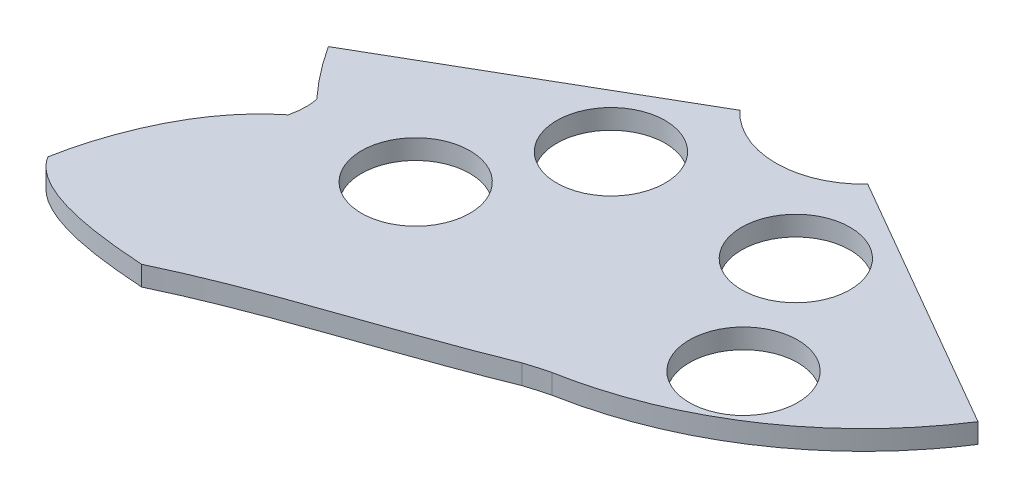
ISO-10303-21;
HEADER;
FILE_DESCRIPTION(('STEP AP214'),'2;1');
FILE_NAME('part.step','',(''),(''),'','','');
FILE_SCHEMA(('AUTOMOTIVE_DESIGN { 1 0 10303 214 1 1 1 1 }'));
ENDSEC;
DATA;
#1=APPLICATION_CONTEXT('core data for automotive mechanical design processes');
#2=APPLICATION_PROTOCOL_DEFINITION('international standard','automotive_design',2000,#1);
#3=PRODUCT_CONTEXT('',#1,'mechanical');
#4=PRODUCT('Part','Part','',(#3));
#5=PRODUCT_RELATED_PRODUCT_CATEGORY('part','',(#4));
#6=PRODUCT_DEFINITION_FORMATION('','',#4);
#7=PRODUCT_DEFINITION_CONTEXT('part definition',#1,'design');
#8=PRODUCT_DEFINITION('design','',#6,#7);
#9=PRODUCT_DEFINITION_SHAPE('','',#8);
#10=(LENGTH_UNIT() NAMED_UNIT(*) SI_UNIT(.MILLI.,.METRE.));
#11=(NAMED_UNIT(*) PLANE_ANGLE_UNIT() SI_UNIT($,.RADIAN.));
#12=(NAMED_UNIT(*) SI_UNIT($,.STERADIAN.) SOLID_ANGLE_UNIT());
#13=UNCERTAINTY_MEASURE_WITH_UNIT(LENGTH_MEASURE(1.E-05),#10,'distance_accuracy_value','');
#14=(GEOMETRIC_REPRESENTATION_CONTEXT(3) GLOBAL_UNCERTAINTY_ASSIGNED_CONTEXT((#13)) GLOBAL_UNIT_ASSIGNED_CONTEXT((#10,
#11,#12)) REPRESENTATION_CONTEXT('',''));
#15=CARTESIAN_POINT('',(0.,0.,0.));
#16=DIRECTION('',(0.,0.,1.));
#17=DIRECTION('',(1.,0.,0.));
#18=AXIS2_PLACEMENT_3D('',#15,#16,#17);
#19=CARTESIAN_POINT('',(-62.0768626037595,-107.736,48.0492829280208));
#20=DIRECTION('',(0.,-1.,0.));
#21=DIRECTION('',(0.,0.,-1.));
#22=AXIS2_PLACEMENT_3D('',#19,#20,#21);
#23=PLANE('',#22);
#24=CARTESIAN_POINT('',(18.75,-107.736,32.476));
#25=DIRECTION('',(0.,-1.,0.));
#26=DIRECTION('',(0.,0.,-1.));
#27=AXIS2_PLACEMENT_3D('',#24,#25,#26);
#28=CIRCLE('',#27,10.999845998306);
#29=CARTESIAN_POINT('',(18.75,-107.736,21.476154001694));
#30=VERTEX_POINT('',#29);
#31=EDGE_CURVE('E441',#30,#30,#28,.T.);
#32=ORIENTED_EDGE('',*,*,#31,.F.);
#33=EDGE_LOOP('',(#32));
#34=FACE_BOUND('',#33,.T.);
#35=CARTESIAN_POINT('',(-33.25,-107.736,57.591));
#36=DIRECTION('',(0.,-1.,0.));
#37=DIRECTION('',(0.,0.,-1.));
#38=AXIS2_PLACEMENT_3D('',#35,#36,#37);
#39=CIRCLE('',#38,10.999845998306);
#40=CARTESIAN_POINT('',(-33.25,-107.736,46.591154001694));
#41=VERTEX_POINT('',#40);
#42=EDGE_CURVE('E422',#41,#41,#39,.T.);
#43=ORIENTED_EDGE('',*,*,#42,.F.);
#44=EDGE_LOOP('',(#43));
#45=FACE_BOUND('',#44,.T.);
#46=CARTESIAN_POINT('',(-65.8942438215736,-107.736,42.6629141284688));
#47=CARTESIAN_POINT('',(-64.697534549004,-107.736,44.5106116386977));
#48=CARTESIAN_POINT('',(-63.4233519327905,-107.736,46.3090861546609));
#49=CARTESIAN_POINT('',(-60.7303627760698,-107.736,49.7894932698036));
#50=CARTESIAN_POINT('',(-59.3101756741057,-107.736,51.4724407077037));
#51=CARTESIAN_POINT('',(-57.8213039212769,-107.736,53.0935760003724));
#52=B_SPLINE_CURVE_WITH_KNOTS('',3,(#46,#47,#48,#49,#50,#51),.UNSPECIFIED.,.F.,.F.,(4,2,4),
(2.95319324550292E-13,0.5,0.999998050745676),.UNSPECIFIED.);
#53=CARTESIAN_POINT('',(-57.8213039212769,-107.736,53.0935760003724));
#54=VERTEX_POINT('',#53);
#55=CARTESIAN_POINT('',(-65.8942438215736,-107.736,42.6629141284688));
#56=VERTEX_POINT('',#55);
#57=EDGE_CURVE('E378',#54,#56,#52,.F.);
#58=ORIENTED_EDGE('',*,*,#57,.T.);
#59=DIRECTION('',(0.866025113443951,0.,-0.500000502884138));
#60=VECTOR('',#59,1.);
#61=CARTESIAN_POINT('',(-65.8942438215736,-107.736,42.6629141284688));
#62=LINE('',#61,#60);
#63=CARTESIAN_POINT('',(-12.9766531358799,-107.736,12.1108879302399));
#64=VERTEX_POINT('',#63);
#65=EDGE_CURVE('E103',#56,#64,#62,.T.);
#66=ORIENTED_EDGE('',*,*,#65,.T.);
#67=CARTESIAN_POINT('',(0.,-107.736,0.));
#68=DIRECTION('',(0.,1.,0.));
#69=DIRECTION('',(0.,0.,-1.));
#70=AXIS2_PLACEMENT_3D('',#67,#68,#69);
#71=CIRCLE('',#70,17.7501305084715);
#72=CARTESIAN_POINT('',(12.9766531358511,-107.736,12.1108879302707));
#73=VERTEX_POINT('',#72);
#74=EDGE_CURVE('E272',#64,#73,#71,.T.);
#75=ORIENTED_EDGE('',*,*,#74,.T.);
#76=DIRECTION('',(0.866025113442765,0.,0.500000502886192));
#77=VECTOR('',#76,1.);
#78=CARTESIAN_POINT('',(12.9766531358511,-107.736,12.1108879302707));
#79=LINE('',#78,#77);
#80=CARTESIAN_POINT('',(65.8946490574718,-107.736,42.6631480920524));
#81=VERTEX_POINT('',#80);
#82=EDGE_CURVE('E249',#73,#81,#79,.T.);
#83=ORIENTED_EDGE('',*,*,#82,.T.);
#84=CARTESIAN_POINT('',(14.0799152497265,-107.736,77.226692480869));
#85=CARTESIAN_POINT('',(19.3312167912184,-107.736,76.2695646023546));
#86=CARTESIAN_POINT('',(24.48389026103,-107.736,74.7750621579223));
#87=CARTESIAN_POINT('',(31.9053713037868,-107.736,71.7742373150547));
#88=CARTESIAN_POINT('',(34.3265085154542,-107.736,70.647676532015));
#89=CARTESIAN_POINT('',(39.0457528228888,-107.736,68.1516209213389));
#90=CARTESIAN_POINT('',(41.3431299527414,-107.736,66.7844016150506));
#91=CARTESIAN_POINT('',(45.7807340194185,-107.736,63.8239341549393));
#92=CARTESIAN_POINT('',(47.9261067628364,-107.736,62.2279642079423));
#93=CARTESIAN_POINT('',(52.0427704907884,-107.736,58.8296490954457));
#94=CARTESIAN_POINT('',(54.013539396055,-107.736,57.0261839302388));
#95=CARTESIAN_POINT('',(59.6359661040794,-107.736,51.3270437357657));
#96=CARTESIAN_POINT('',(62.9940513969789,-107.736,47.14361349488));
#97=CARTESIAN_POINT('',(65.8946490574718,-107.736,42.6631480920524));
#98=B_SPLINE_CURVE_WITH_KNOTS('',3,(#84,#85,#86,#87,#88,#89,#90,#91,#92,#93,#94,#95,#96,#97),
.UNSPECIFIED.,.F.,.F.,(4,2,2,2,2,2,4),(0.,0.25,0.375,0.5,0.625,0.75,1.),.UNSPECIFIED.);
#99=CARTESIAN_POINT('',(14.0799152497265,-107.736,77.226692480869));
#100=VERTEX_POINT('',#99);
#101=EDGE_CURVE('E244',#81,#100,#98,.F.);
#102=ORIENTED_EDGE('',*,*,#101,.T.);
#103=CARTESIAN_POINT('',(9.29434132516,-107.736,78.5959146266122));
#104=CARTESIAN_POINT('',(9.69660243619222,-107.736,78.4693255515524));
#105=CARTESIAN_POINT('',(10.4897871621421,-107.736,78.2197160785021));
#106=CARTESIAN_POINT('',(11.6825273158592,-107.736,77.8654256040642));
#107=CARTESIAN_POINT('',(12.8745506760003,-107.736,77.5315231981379));
#108=CARTESIAN_POINT('',(13.6772835772342,-107.736,77.3285160768838));
#109=CARTESIAN_POINT('',(14.0799162001242,-107.736,77.2266923076448));
#110=B_SPLINE_CURVE_WITH_KNOTS('',3,(#103,#104,#105,#106,#107,#108,#109),.UNSPECIFIED.,.F.,.F.,
(4,1,1,1,4),(0.,0.25410764137627,0.501053258036882,0.749724763833674,0.999970179886342),.UNSPECIFIED.);
#111=CARTESIAN_POINT('',(9.29434132515999,-107.736,78.5959146266122));
#112=VERTEX_POINT('',#111);
#113=EDGE_CURVE('E321',#100,#112,#110,.F.);
#114=ORIENTED_EDGE('',*,*,#113,.T.);
#115=CARTESIAN_POINT('',(-46.5850124269193,-107.736,99.8488194615322));
#116=CARTESIAN_POINT('',(-45.9616811254653,-107.736,99.5545732330263));
#117=CARTESIAN_POINT('',(-44.71198210369,-107.736,98.9646474213959));
#118=CARTESIAN_POINT('',(-42.8194690703494,-107.736,98.1066629226478));
#119=CARTESIAN_POINT('',(-39.8563096539644,-107.736,96.8013862131623));
#120=CARTESIAN_POINT('',(-35.7637819427948,-107.736,95.0970149808272));
#121=CARTESIAN_POINT('',(-30.543661075741,-107.736,93.0686195363044));
#122=CARTESIAN_POINT('',(-25.2646562630741,-107.736,91.1262657322691));
#123=CARTESIAN_POINT('',(-19.9807685699677,-107.736,89.2526831396821));
#124=CARTESIAN_POINT('',(-14.6805976138817,-107.736,87.4090495126098));
#125=CARTESIAN_POINT('',(-9.40632905887307,-107.736,85.5741536780162));
#126=CARTESIAN_POINT('',(-4.12260232325872,-107.736,83.7030961027021));
#127=CARTESIAN_POINT('',(-0.177378606405732,-107.736,82.2599627000972));
#128=CARTESIAN_POINT('',(2.46834413911105,-107.736,81.2650238209064));
#129=CARTESIAN_POINT('',(3.79360956536933,-107.736,80.760851264305));
#130=CARTESIAN_POINT('',(5.14000128888291,-107.736,80.2422975680367));
#131=CARTESIAN_POINT('',(6.50711351403022,-107.736,79.7086038641988));
#132=CARTESIAN_POINT('',(7.89488761960886,-107.736,79.1598364987836));
#133=CARTESIAN_POINT('',(8.82531051601245,-107.736,78.7849145358299));
#134=CARTESIAN_POINT('',(9.29434132516002,-107.736,78.5959146266123));
#135=B_SPLINE_CURVE_WITH_KNOTS('',3,(#115,#116,#117,#118,#119,#120,#121,#122,#123,#124,#125,
#126,#127,#128,#129,#130,#131,#132,#133,#134),.UNSPECIFIED.,.F.,.F.,(4,1,1,1,1,1,1,1,1,1,1,1,1,
1,1,1,1,4),(-1.66023043968178E-06,0.0345729361788144,0.0693159549930038,0.104223297479443,
0.196985178761582,0.291657601883268,0.38511941769474,0.479126085457175,0.572863896729146,
0.666601747177814,0.759237149896721,0.854021240845666,0.877312413463795,0.901020558607064,
0.925144625202436,0.949683294173959,0.974635100539898,1.),.UNSPECIFIED.);
#136=CARTESIAN_POINT('',(-46.5850124269193,-107.736,99.8488194615322));
#137=VERTEX_POINT('',#136);
#138=EDGE_CURVE('E129',#112,#137,#135,.F.);
#139=ORIENTED_EDGE('',*,*,#138,.T.);
#140=CARTESIAN_POINT('',(-1684.97919223289,-107.736,1238.52970661268));
#141=CARTESIAN_POINT('',(2157.13654465002,-107.736,-1023.42476787053));
#142=CARTESIAN_POINT('',(-2164.09602519941,-107.736,1202.16160217601));
#143=CARTESIAN_POINT('',(1616.79334056769,-107.736,-974.040537299898));
#144=B_SPLINE_CURVE_WITH_KNOTS('',3,(#140,#141,#142,#143),.UNSPECIFIED.,.F.,.F.,(4,4),
(-8.71894325142486,7.17663895418949),.UNSPECIFIED.);
#145=CARTESIAN_POINT('',(-74.9664323702771,-107.736,90.4749867451479));
#146=VERTEX_POINT('',#145);
#147=EDGE_CURVE('E122',#137,#146,#144,.T.);
#148=ORIENTED_EDGE('',*,*,#147,.T.);
#149=CARTESIAN_POINT('',(-57.9555940137423,-107.736,58.714190686936));
#150=CARTESIAN_POINT('',(-58.2620991995066,-107.736,58.9652928452924));
#151=CARTESIAN_POINT('',(-58.8738990087398,-107.736,59.4665054175932));
#152=CARTESIAN_POINT('',(-59.7599721005752,-107.736,60.2527460806104));
#153=CARTESIAN_POINT('',(-60.620464740858,-107.736,61.0616825246587));
#154=CARTESIAN_POINT('',(-61.453662674023,-107.736,61.8957202862609));
#155=CARTESIAN_POINT('',(-62.7233791872045,-107.736,63.2462447158875));
#156=CARTESIAN_POINT('',(-64.3711350083455,-107.736,65.2091580603502));
#157=CARTESIAN_POINT('',(-66.2235184860781,-107.736,67.807024931806));
#158=CARTESIAN_POINT('',(-67.9113450550934,-107.736,70.5691857869069));
#159=CARTESIAN_POINT('',(-69.4266629824327,-107.736,73.448523116184));
#160=CARTESIAN_POINT('',(-70.7746038630378,-107.736,76.4102041780972));
#161=CARTESIAN_POINT('',(-71.9728761870161,-107.736,79.43362831518));
#162=CARTESIAN_POINT('',(-72.9996706378584,-107.736,82.4424320827859));
#163=CARTESIAN_POINT('',(-73.6778556670298,-107.736,84.792266532568));
#164=CARTESIAN_POINT('',(-74.0793789291522,-107.736,86.3578878892544));
#165=CARTESIAN_POINT('',(-74.2814581563144,-107.736,87.1905425837074));
#166=CARTESIAN_POINT('',(-74.4712423372958,-107.736,88.0186793097025));
#167=CARTESIAN_POINT('',(-74.6486043716607,-107.736,88.8419341312262));
#168=CARTESIAN_POINT('',(-74.8146501216004,-107.736,89.6597292689675));
#169=CARTESIAN_POINT('',(-74.9159988369513,-107.736,90.2040966018059));
#170=CARTESIAN_POINT('',(-74.9664323702866,-107.736,90.4749867451326));
#171=B_SPLINE_CURVE_WITH_KNOTS('',3,(#149,#150,#151,#152,#153,#154,#155,#156,#157,#158,#159,
#160,#161,#162,#163,#164,#165,#166,#167,#168,#169,#170),.UNSPECIFIED.,.F.,.F.,(4,1,1,1,1,1,1,1,
1,1,1,1,1,1,1,1,1,1,1,4),(0.,0.032322670934082,0.0645176813634101,0.0966194451803988,
0.128661972739536,0.160678707552363,0.247829670759691,0.337492962507337,0.420726743442327,
0.511730298344634,0.602767096762516,0.686066620443517,0.776959935344694,0.862024306950541,
0.885516143544052,0.908818250622432,0.931923933053828,0.95482679139406,0.977520736062578,1.),.UNSPECIFIED.);
#172=CARTESIAN_POINT('',(-57.9555940137423,-107.736,58.714190686936));
#173=VERTEX_POINT('',#172);
#174=EDGE_CURVE('E126',#146,#173,#171,.F.);
#175=ORIENTED_EDGE('',*,*,#174,.T.);
#176=CARTESIAN_POINT('',(-57.8213039212769,-107.736,53.0935760003724));
#177=CARTESIAN_POINT('',(-57.799585426198,-107.736,53.196556014396));
#178=CARTESIAN_POINT('',(-57.7560212050093,-107.736,53.403119318742));
#179=CARTESIAN_POINT('',(-57.7034010901703,-107.736,53.7164645301854));
#180=CARTESIAN_POINT('',(-57.6596465547564,-107.736,54.03325358893));
#181=CARTESIAN_POINT('',(-57.6255199693396,-107.736,54.3536040078919));
#182=CARTESIAN_POINT('',(-57.5933954970153,-107.736,54.771097290538));
#183=CARTESIAN_POINT('',(-57.5744529676634,-107.736,55.2890768813089));
#184=CARTESIAN_POINT('',(-57.581934369221,-107.736,55.9367618098759));
#185=CARTESIAN_POINT('',(-57.6231341937822,-107.736,56.6211160636005));
#186=CARTESIAN_POINT('',(-57.7021822917049,-107.736,57.3302436771103));
#187=CARTESIAN_POINT('',(-57.8104052681699,-107.736,58.0301388464011));
#188=CARTESIAN_POINT('',(-57.9073771570179,-107.736,58.4870187502773));
#189=CARTESIAN_POINT('',(-57.9555940137423,-107.736,58.714190686936));
#190=B_SPLINE_CURVE_WITH_KNOTS('',3,(#176,#177,#178,#179,#180,#181,#182,#183,#184,#185,#186,
#187,#188,#189),.UNSPECIFIED.,.F.,.F.,(4,1,1,1,1,1,1,1,1,1,1,4),(-1.64834812466097E-12,
0.0557223320642951,0.111771096036229,0.168194505070812,0.225034387311382,0.282327235684502,
0.389884532307823,0.499360217402428,0.62518478450591,0.752731997244265,0.877051823215496,
0.999999137799591),.UNSPECIFIED.);
#191=EDGE_CURVE('E51',#173,#54,#190,.F.);
#192=ORIENTED_EDGE('',*,*,#191,.T.);
#193=EDGE_LOOP('',(#58,#66,#75,#83,#102,#114,#139,#148,#175,#192));
#194=FACE_BOUND('',#193,.T.);
#195=CARTESIAN_POINT('',(33.25,-107.736,57.591));
#196=DIRECTION('',(0.,-1.,0.));
#197=DIRECTION('',(0.,0.,-1.));
#198=AXIS2_PLACEMENT_3D('',#195,#196,#197);
#199=CIRCLE('',#198,10.999845998306);
#200=CARTESIAN_POINT('',(33.25,-107.736,46.591154001694));
#201=VERTEX_POINT('',#200);
#202=EDGE_CURVE('E429',#201,#201,#199,.T.);
#203=ORIENTED_EDGE('',*,*,#202,.F.);
#204=EDGE_LOOP('',(#203));
#205=FACE_BOUND('',#204,.T.);
#206=CARTESIAN_POINT('',(-18.75,-107.736,32.476));
#207=DIRECTION('',(0.,-1.,0.));
#208=DIRECTION('',(0.,0.,-1.));
#209=AXIS2_PLACEMENT_3D('',#206,#207,#208);
#210=CIRCLE('',#209,10.999845998306);
#211=CARTESIAN_POINT('',(-18.75,-107.736,21.476154001694));
#212=VERTEX_POINT('',#211);
#213=EDGE_CURVE('E447',#212,#212,#210,.T.);
#214=ORIENTED_EDGE('',*,*,#213,.F.);
#215=EDGE_LOOP('',(#214));
#216=FACE_BOUND('',#215,.T.);
#217=ADVANCED_FACE('F30',(#34,#45,#194,#205,#216),#23,.T.);
#218=CARTESIAN_POINT('',(-62.0768626037595,-103.736,48.0492829280208));
#219=DIRECTION('',(0.,-1.,0.));
#220=DIRECTION('',(0.,0.,-1.));
#221=AXIS2_PLACEMENT_3D('',#218,#219,#220);
#222=PLANE('',#221);
#223=CARTESIAN_POINT('',(18.75,-103.736,32.476));
#224=DIRECTION('',(0.,-1.,0.));
#225=DIRECTION('',(0.,0.,-1.));
#226=AXIS2_PLACEMENT_3D('',#223,#224,#225);
#227=CIRCLE('',#226,10.999845998306);
#228=CARTESIAN_POINT('',(18.75,-103.736,21.476154001694));
#229=VERTEX_POINT('',#228);
#230=EDGE_CURVE('E444',#229,#229,#227,.T.);
#231=ORIENTED_EDGE('',*,*,#230,.T.);
#232=EDGE_LOOP('',(#231));
#233=FACE_BOUND('',#232,.T.);
#234=CARTESIAN_POINT('',(-33.25,-103.736,57.591));
#235=DIRECTION('',(0.,-1.,0.));
#236=DIRECTION('',(0.,0.,-1.));
#237=AXIS2_PLACEMENT_3D('',#234,#235,#236);
#238=CIRCLE('',#237,10.999845998306);
#239=CARTESIAN_POINT('',(-33.25,-103.736,46.591154001694));
#240=VERTEX_POINT('',#239);
#241=EDGE_CURVE('E424',#240,#240,#238,.T.);
#242=ORIENTED_EDGE('',*,*,#241,.T.);
#243=EDGE_LOOP('',(#242));
#244=FACE_BOUND('',#243,.T.);
#245=CARTESIAN_POINT('',(-57.8213039212769,-103.736,53.0935760003724));
#246=CARTESIAN_POINT('',(-59.3101756741057,-103.736,51.4724407077037));
#247=CARTESIAN_POINT('',(-60.7303627760698,-103.736,49.7894932698036));
#248=CARTESIAN_POINT('',(-63.4233519327905,-103.736,46.3090861546609));
#249=CARTESIAN_POINT('',(-64.697534549004,-103.736,44.5106116386977));
#250=CARTESIAN_POINT('',(-65.8942438215736,-103.736,42.6629141284688));
#251=B_SPLINE_CURVE_WITH_KNOTS('',3,(#245,#246,#247,#248,#249,#250),.UNSPECIFIED.,.F.,.F.,(4,2,
4),(2.95293365002782E-13,0.499998050745972,0.999998050745676),.UNSPECIFIED.);
#252=CARTESIAN_POINT('',(-57.8213039212769,-103.736,53.0935760003724));
#253=VERTEX_POINT('',#252);
#254=CARTESIAN_POINT('',(-65.8942438215736,-103.736,42.6629141284688));
#255=VERTEX_POINT('',#254);
#256=EDGE_CURVE('E405',#253,#255,#251,.T.);
#257=ORIENTED_EDGE('',*,*,#256,.F.);
#258=CARTESIAN_POINT('',(-57.9555940137423,-103.736,58.714190686936));
#259=CARTESIAN_POINT('',(-57.9073771570179,-103.736,58.4870187502773));
#260=CARTESIAN_POINT('',(-57.8104052681699,-103.736,58.0301388464011));
#261=CARTESIAN_POINT('',(-57.7021822917049,-103.736,57.3302436771103));
#262=CARTESIAN_POINT('',(-57.6231341937822,-103.736,56.6211160636005));
#263=CARTESIAN_POINT('',(-57.581934369221,-103.736,55.9367618098759));
#264=CARTESIAN_POINT('',(-57.5744529676634,-103.736,55.2890768813089));
#265=CARTESIAN_POINT('',(-57.5933954970153,-103.736,54.771097290538));
#266=CARTESIAN_POINT('',(-57.6255199693396,-103.736,54.3536040078919));
#267=CARTESIAN_POINT('',(-57.6596465547564,-103.736,54.03325358893));
#268=CARTESIAN_POINT('',(-57.7034010901703,-103.736,53.7164645301854));
#269=CARTESIAN_POINT('',(-57.7560212050093,-103.736,53.403119318742));
#270=CARTESIAN_POINT('',(-57.799585426198,-103.736,53.196556014396));
#271=CARTESIAN_POINT('',(-57.8213039212769,-103.736,53.0935760003724));
#272=B_SPLINE_CURVE_WITH_KNOTS('',3,(#258,#259,#260,#261,#262,#263,#264,#265,#266,#267,#268,
#269,#270,#271),.UNSPECIFIED.,.F.,.F.,(4,1,1,1,1,1,1,1,1,1,1,4),(-1.64829599056582E-12,
0.122947314582446,0.247267140553677,0.374814353292033,0.500638920395514,0.610114605490119,
0.71767190211344,0.77496475048656,0.83180463272713,0.888228041761713,0.944276805733647,
0.999999137799591),.UNSPECIFIED.);
#273=CARTESIAN_POINT('',(-57.9555940137423,-103.736,58.714190686936));
#274=VERTEX_POINT('',#273);
#275=EDGE_CURVE('E94',#274,#253,#272,.T.);
#276=ORIENTED_EDGE('',*,*,#275,.F.);
#277=CARTESIAN_POINT('',(-74.9664323702866,-103.736,90.4749867451326));
#278=CARTESIAN_POINT('',(-74.9159988369513,-103.736,90.2040966018059));
#279=CARTESIAN_POINT('',(-74.8146501216004,-103.736,89.6597292689675));
#280=CARTESIAN_POINT('',(-74.6486043716607,-103.736,88.8419341312262));
#281=CARTESIAN_POINT('',(-74.4712423372958,-103.736,88.0186793097025));
#282=CARTESIAN_POINT('',(-74.2814581563144,-103.736,87.1905425837074));
#283=CARTESIAN_POINT('',(-74.0793789291522,-103.736,86.3578878892544));
#284=CARTESIAN_POINT('',(-73.6778556670298,-103.736,84.792266532568));
#285=CARTESIAN_POINT('',(-72.9996706378584,-103.736,82.4424320827859));
#286=CARTESIAN_POINT('',(-71.9728761870161,-103.736,79.43362831518));
#287=CARTESIAN_POINT('',(-70.7746038630378,-103.736,76.4102041780972));
#288=CARTESIAN_POINT('',(-69.4266629824327,-103.736,73.448523116184));
#289=CARTESIAN_POINT('',(-67.9113450550934,-103.736,70.5691857869069));
#290=CARTESIAN_POINT('',(-66.2235184860781,-103.736,67.807024931806));
#291=CARTESIAN_POINT('',(-64.3711350083455,-103.736,65.2091580603502));
#292=CARTESIAN_POINT('',(-62.7233791872045,-103.736,63.2462447158875));
#293=CARTESIAN_POINT('',(-61.453662674023,-103.736,61.8957202862609));
#294=CARTESIAN_POINT('',(-60.620464740858,-103.736,61.0616825246587));
#295=CARTESIAN_POINT('',(-59.7599721005752,-103.736,60.2527460806104));
#296=CARTESIAN_POINT('',(-58.8738990087398,-103.736,59.4665054175932));
#297=CARTESIAN_POINT('',(-58.2620991995066,-103.736,58.9652928452924));
#298=CARTESIAN_POINT('',(-57.9555940137423,-103.736,58.714190686936));
#299=B_SPLINE_CURVE_WITH_KNOTS('',3,(#277,#278,#279,#280,#281,#282,#283,#284,#285,#286,#287,
#288,#289,#290,#291,#292,#293,#294,#295,#296,#297,#298),.UNSPECIFIED.,.F.,.F.,(4,1,1,1,1,1,1,1,
1,1,1,1,1,1,1,1,1,1,1,4),(0.,0.0224792639374224,0.0451732086059403,0.0680760669461721,
0.0911817493775676,0.114483856455948,0.137975693049459,0.223040064655306,0.313933379556483,
0.397232903237484,0.488269701655366,0.579273256557673,0.662507037492663,0.752170329240309,
0.839321292447637,0.871338027260464,0.903380554819601,0.93548231863659,0.967677329065918,1.),.UNSPECIFIED.);
#300=CARTESIAN_POINT('',(-74.9664323702771,-103.736,90.4749867451479));
#301=VERTEX_POINT('',#300);
#302=EDGE_CURVE('E87',#301,#274,#299,.T.);
#303=ORIENTED_EDGE('',*,*,#302,.F.);
#304=CARTESIAN_POINT('',(-1684.97919223289,-103.736,1238.52970661268));
#305=CARTESIAN_POINT('',(2157.13654465002,-103.736,-1023.42476787053));
#306=CARTESIAN_POINT('',(-2164.09602519941,-103.736,1202.16160217601));
#307=CARTESIAN_POINT('',(1616.79334056769,-103.736,-974.040537299898));
#308=B_SPLINE_CURVE_WITH_KNOTS('',3,(#304,#305,#306,#307),.UNSPECIFIED.,.F.,.F.,(4,4),
(-8.71894325142486,7.17663895418949),.UNSPECIFIED.);
#309=CARTESIAN_POINT('',(-46.5850124269193,-103.736,99.8488194615322));
#310=VERTEX_POINT('',#309);
#311=EDGE_CURVE('E138',#310,#301,#308,.T.);
#312=ORIENTED_EDGE('',*,*,#311,.F.);
#313=CARTESIAN_POINT('',(9.29434132516002,-103.736,78.5959146266123));
#314=CARTESIAN_POINT('',(8.82531051601245,-103.736,78.7849145358299));
#315=CARTESIAN_POINT('',(7.89488761960886,-103.736,79.1598364987836));
#316=CARTESIAN_POINT('',(6.50711351403022,-103.736,79.7086038641988));
#317=CARTESIAN_POINT('',(5.14000128888291,-103.736,80.2422975680367));
#318=CARTESIAN_POINT('',(3.79360956536933,-103.736,80.760851264305));
#319=CARTESIAN_POINT('',(2.46834413911105,-103.736,81.2650238209064));
#320=CARTESIAN_POINT('',(-0.177378606405732,-103.736,82.2599627000972));
#321=CARTESIAN_POINT('',(-4.12260232325872,-103.736,83.7030961027021));
#322=CARTESIAN_POINT('',(-9.40632905887307,-103.736,85.5741536780162));
#323=CARTESIAN_POINT('',(-14.6805976138817,-103.736,87.4090495126098));
#324=CARTESIAN_POINT('',(-19.9807685699677,-103.736,89.2526831396821));
#325=CARTESIAN_POINT('',(-25.2646562630741,-103.736,91.1262657322691));
#326=CARTESIAN_POINT('',(-30.543661075741,-103.736,93.0686195363044));
#327=CARTESIAN_POINT('',(-35.7637819427948,-103.736,95.0970149808272));
#328=CARTESIAN_POINT('',(-39.8563096539644,-103.736,96.8013862131623));
#329=CARTESIAN_POINT('',(-42.8194690703494,-103.736,98.1066629226478));
#330=CARTESIAN_POINT('',(-44.71198210369,-103.736,98.9646474213959));
#331=CARTESIAN_POINT('',(-45.9616811254653,-103.736,99.5545732330263));
#332=CARTESIAN_POINT('',(-46.5850124269193,-103.736,99.8488194615322));
#333=B_SPLINE_CURVE_WITH_KNOTS('',3,(#313,#314,#315,#316,#317,#318,#319,#320,#321,#322,#323,
#324,#325,#326,#327,#328,#329,#330,#331,#332),.UNSPECIFIED.,.F.,.F.,(4,1,1,1,1,1,1,1,1,1,1,1,1,
1,1,1,1,4),(-1.66023043972442E-06,0.0253632392296627,0.0503150455956012,0.0748537145671241,
0.0989777811624967,0.122685926305766,0.145977098923894,0.24076118987284,0.333396592591746,
0.427134443040415,0.520872254312385,0.61487892207482,0.708340737886292,0.803013161007978,
0.895775042290117,0.930682384776557,0.965425403590746,1.),.UNSPECIFIED.);
#334=CARTESIAN_POINT('',(9.29434132515999,-103.736,78.5959146266122));
#335=VERTEX_POINT('',#334);
#336=EDGE_CURVE('E312',#335,#310,#333,.T.);
#337=ORIENTED_EDGE('',*,*,#336,.F.);
#338=CARTESIAN_POINT('',(14.0799162001242,-103.736,77.2266923076448));
#339=CARTESIAN_POINT('',(13.6772835772342,-103.736,77.3285160768838));
#340=CARTESIAN_POINT('',(12.8745506760003,-103.736,77.5315231981379));
#341=CARTESIAN_POINT('',(11.6825273158592,-103.736,77.8654256040642));
#342=CARTESIAN_POINT('',(10.4897871621421,-103.736,78.2197160785021));
#343=CARTESIAN_POINT('',(9.69660243619222,-103.736,78.4693255515524));
#344=CARTESIAN_POINT('',(9.29434132516,-103.736,78.5959146266122));
#345=B_SPLINE_CURVE_WITH_KNOTS('',3,(#338,#339,#340,#341,#342,#343,#344),.UNSPECIFIED.,.F.,.F.,
(4,1,1,1,4),(0.,0.250245416052668,0.49891692184946,0.745862538510072,0.999970179886342),.UNSPECIFIED.);
#346=CARTESIAN_POINT('',(14.0799152497265,-103.736,77.226692480869));
#347=VERTEX_POINT('',#346);
#348=EDGE_CURVE('E327',#347,#335,#345,.T.);
#349=ORIENTED_EDGE('',*,*,#348,.F.);
#350=CARTESIAN_POINT('',(65.8946490574718,-103.736,42.6631480920524));
#351=CARTESIAN_POINT('',(62.9940513969789,-103.736,47.14361349488));
#352=CARTESIAN_POINT('',(59.6359661040794,-103.736,51.3270437357657));
#353=CARTESIAN_POINT('',(54.013539396055,-103.736,57.0261839302388));
#354=CARTESIAN_POINT('',(52.0427704907884,-103.736,58.8296490954457));
#355=CARTESIAN_POINT('',(47.9261067628364,-103.736,62.2279642079423));
#356=CARTESIAN_POINT('',(45.7807340194185,-103.736,63.8239341549393));
#357=CARTESIAN_POINT('',(41.3431299527414,-103.736,66.7844016150506));
#358=CARTESIAN_POINT('',(39.0457528228888,-103.736,68.1516209213389));
#359=CARTESIAN_POINT('',(34.3265085154542,-103.736,70.647676532015));
#360=CARTESIAN_POINT('',(31.9053713037868,-103.736,71.7742373150547));
#361=CARTESIAN_POINT('',(24.48389026103,-103.736,74.7750621579223));
#362=CARTESIAN_POINT('',(19.3312167912184,-103.736,76.2695646023546));
#363=CARTESIAN_POINT('',(14.0799152497265,-103.736,77.226692480869));
#364=B_SPLINE_CURVE_WITH_KNOTS('',3,(#350,#351,#352,#353,#354,#355,#356,#357,#358,#359,#360,
#361,#362,#363),.UNSPECIFIED.,.F.,.F.,(4,2,2,2,2,2,4),(0.,0.25,0.375,0.5,0.625,0.75,1.),.UNSPECIFIED.);
#365=CARTESIAN_POINT('',(65.8946490574718,-103.736,42.6631480920524));
#366=VERTEX_POINT('',#365);
#367=EDGE_CURVE('E363',#366,#347,#364,.T.);
#368=ORIENTED_EDGE('',*,*,#367,.F.);
#369=DIRECTION('',(0.866025113442765,0.,0.500000502886192));
#370=VECTOR('',#369,1.);
#371=CARTESIAN_POINT('',(12.9766531358511,-103.736,12.1108879302707));
#372=LINE('',#371,#370);
#373=CARTESIAN_POINT('',(12.9766531358511,-103.736,12.1108879302707));
#374=VERTEX_POINT('',#373);
#375=EDGE_CURVE('E188',#374,#366,#372,.T.);
#376=ORIENTED_EDGE('',*,*,#375,.F.);
#377=CARTESIAN_POINT('',(0.,-103.736,0.));
#378=DIRECTION('',(0.,1.,0.));
#379=DIRECTION('',(0.,0.,-1.));
#380=AXIS2_PLACEMENT_3D('',#377,#378,#379);
#381=CIRCLE('',#380,17.7501305084715);
#382=CARTESIAN_POINT('',(-12.9766531358799,-103.736,12.1108879302399));
#383=VERTEX_POINT('',#382);
#384=EDGE_CURVE('E183',#383,#374,#381,.T.);
#385=ORIENTED_EDGE('',*,*,#384,.F.);
#386=DIRECTION('',(0.866025113443951,0.,-0.500000502884138));
#387=VECTOR('',#386,1.);
#388=CARTESIAN_POINT('',(-65.8942438215736,-103.736,42.6629141284688));
#389=LINE('',#388,#387);
#390=EDGE_CURVE('E189',#255,#383,#389,.T.);
#391=ORIENTED_EDGE('',*,*,#390,.F.);
#392=EDGE_LOOP('',(#257,#276,#303,#312,#337,#349,#368,#376,#385,#391));
#393=FACE_BOUND('',#392,.T.);
#394=CARTESIAN_POINT('',(33.25,-103.736,57.591));
#395=DIRECTION('',(0.,-1.,0.));
#396=DIRECTION('',(0.,0.,-1.));
#397=AXIS2_PLACEMENT_3D('',#394,#395,#396);
#398=CIRCLE('',#397,10.999845998306);
#399=CARTESIAN_POINT('',(33.25,-103.736,46.591154001694));
#400=VERTEX_POINT('',#399);
#401=EDGE_CURVE('E432',#400,#400,#398,.T.);
#402=ORIENTED_EDGE('',*,*,#401,.T.);
#403=EDGE_LOOP('',(#402));
#404=FACE_BOUND('',#403,.T.);
#405=CARTESIAN_POINT('',(-18.75,-103.736,32.476));
#406=DIRECTION('',(0.,-1.,0.));
#407=DIRECTION('',(0.,0.,-1.));
#408=AXIS2_PLACEMENT_3D('',#405,#406,#407);
#409=CIRCLE('',#408,10.999845998306);
#410=CARTESIAN_POINT('',(-18.75,-103.736,21.476154001694));
#411=VERTEX_POINT('',#410);
#412=EDGE_CURVE('E450',#411,#411,#409,.T.);
#413=ORIENTED_EDGE('',*,*,#412,.T.);
#414=EDGE_LOOP('',(#413));
#415=FACE_BOUND('',#414,.T.);
#416=ADVANCED_FACE('F208',(#233,#244,#393,#404,#415),#222,.F.);
#417=CARTESIAN_POINT('',(-57.8213039212769,-107.736,53.0935760003724));
#418=CARTESIAN_POINT('',(-59.3101756741057,-107.736,51.4724407077037));
#419=CARTESIAN_POINT('',(-60.7303627760698,-107.736,49.7894932698036));
#420=CARTESIAN_POINT('',(-63.4233519327905,-107.736,46.3090861546609));
#421=CARTESIAN_POINT('',(-64.697534549004,-107.736,44.5106116386977));
#422=CARTESIAN_POINT('',(-65.8942438215736,-107.736,42.6629141284688));
#423=B_SPLINE_CURVE_WITH_KNOTS('',3,(#417,#418,#419,#420,#421,#422),.UNSPECIFIED.,.F.,.F.,(4,2,
4),(2.95293365002782E-13,0.499998050745972,0.999998050745676),.UNSPECIFIED.);
#424=DIRECTION('',(0.,1.,0.));
#425=VECTOR('',#424,1.);
#426=SURFACE_OF_LINEAR_EXTRUSION('',#423,#425);
#427=ORIENTED_EDGE('',*,*,#256,.T.);
#428=DIRECTION('',(0.,1.,0.));
#429=VECTOR('',#428,1.);
#430=CARTESIAN_POINT('',(-65.8942438215736,-107.736,42.6629141284688));
#431=LINE('',#430,#429);
#432=EDGE_CURVE('E11',#56,#255,#431,.T.);
#433=ORIENTED_EDGE('',*,*,#432,.F.);
#434=ORIENTED_EDGE('',*,*,#57,.F.);
#435=DIRECTION('',(0.,1.,0.));
#436=VECTOR('',#435,1.);
#437=CARTESIAN_POINT('',(-57.8213039212769,-107.736,53.0935760003724));
#438=LINE('',#437,#436);
#439=EDGE_CURVE('E652',#54,#253,#438,.T.);
#440=ORIENTED_EDGE('',*,*,#439,.T.);
#441=EDGE_LOOP('',(#427,#433,#434,#440));
#442=FACE_BOUND('',#441,.T.);
#443=ADVANCED_FACE('F32',(#442),#426,.F.);
#444=CARTESIAN_POINT('',(-65.8942438215736,-107.736,42.6629141284688));
#445=DIRECTION('',(0.500000502884138,0.,0.866025113443951));
#446=DIRECTION('',(0.866025113443951,0.,-0.500000502884138));
#447=AXIS2_PLACEMENT_3D('',#444,#445,#446);
#448=PLANE('',#447);
#449=ORIENTED_EDGE('',*,*,#390,.T.);
#450=DIRECTION('',(0.,1.,0.));
#451=VECTOR('',#450,1.);
#452=CARTESIAN_POINT('',(-12.9766531358799,-107.736,12.1108879302399));
#453=LINE('',#452,#451);
#454=EDGE_CURVE('E42',#64,#383,#453,.T.);
#455=ORIENTED_EDGE('',*,*,#454,.F.);
#456=ORIENTED_EDGE('',*,*,#65,.F.);
#457=ORIENTED_EDGE('',*,*,#432,.T.);
#458=EDGE_LOOP('',(#449,#455,#456,#457));
#459=FACE_BOUND('',#458,.T.);
#460=ADVANCED_FACE('F469',(#459),#448,.F.);
#461=CARTESIAN_POINT('',(0.,-107.736,0.));
#462=DIRECTION('',(0.,1.,0.));
#463=DIRECTION('',(0.,0.,1.));
#464=AXIS2_PLACEMENT_3D('',#461,#462,#463);
#465=CYLINDRICAL_SURFACE('',#464,17.7501305084715);
#466=ORIENTED_EDGE('',*,*,#384,.T.);
#467=DIRECTION('',(0.,1.,0.));
#468=VECTOR('',#467,1.);
#469=CARTESIAN_POINT('',(12.9766531358511,-107.736,12.1108879302707));
#470=LINE('',#469,#468);
#471=EDGE_CURVE('E190',#73,#374,#470,.T.);
#472=ORIENTED_EDGE('',*,*,#471,.F.);
#473=ORIENTED_EDGE('',*,*,#74,.F.);
#474=ORIENTED_EDGE('',*,*,#454,.T.);
#475=EDGE_LOOP('',(#466,#472,#473,#474));
#476=FACE_BOUND('',#475,.T.);
#477=ADVANCED_FACE('F517',(#476),#465,.F.);
#478=CARTESIAN_POINT('',(12.9766531358511,-107.736,12.1108879302707));
#479=DIRECTION('',(-0.500000502886192,0.,0.866025113442765));
#480=DIRECTION('',(0.866025113442765,0.,0.500000502886192));
#481=AXIS2_PLACEMENT_3D('',#478,#479,#480);
#482=PLANE('',#481);
#483=ORIENTED_EDGE('',*,*,#375,.T.);
#484=DIRECTION('',(0.,1.,0.));
#485=VECTOR('',#484,1.);
#486=CARTESIAN_POINT('',(65.8946490574718,-107.736,42.6631480920524));
#487=LINE('',#486,#485);
#488=EDGE_CURVE('E193',#81,#366,#487,.T.);
#489=ORIENTED_EDGE('',*,*,#488,.F.);
#490=ORIENTED_EDGE('',*,*,#82,.F.);
#491=ORIENTED_EDGE('',*,*,#471,.T.);
#492=EDGE_LOOP('',(#483,#489,#490,#491));
#493=FACE_BOUND('',#492,.T.);
#494=ADVANCED_FACE('F263',(#493),#482,.F.);
#495=CARTESIAN_POINT('',(65.8946490574718,-107.736,42.6631480920524));
#496=CARTESIAN_POINT('',(62.9940513969789,-107.736,47.14361349488));
#497=CARTESIAN_POINT('',(59.6359661040794,-107.736,51.3270437357657));
#498=CARTESIAN_POINT('',(54.013539396055,-107.736,57.0261839302388));
#499=CARTESIAN_POINT('',(52.0427704907884,-107.736,58.8296490954457));
#500=CARTESIAN_POINT('',(47.9261067628364,-107.736,62.2279642079423));
#501=CARTESIAN_POINT('',(45.7807340194185,-107.736,63.8239341549393));
#502=CARTESIAN_POINT('',(41.3431299527414,-107.736,66.7844016150506));
#503=CARTESIAN_POINT('',(39.0457528228888,-107.736,68.1516209213389));
#504=CARTESIAN_POINT('',(34.3265085154542,-107.736,70.647676532015));
#505=CARTESIAN_POINT('',(31.9053713037868,-107.736,71.7742373150547));
#506=CARTESIAN_POINT('',(24.48389026103,-107.736,74.7750621579223));
#507=CARTESIAN_POINT('',(19.3312167912184,-107.736,76.2695646023546));
#508=CARTESIAN_POINT('',(14.0799152497265,-107.736,77.226692480869));
#509=B_SPLINE_CURVE_WITH_KNOTS('',3,(#495,#496,#497,#498,#499,#500,#501,#502,#503,#504,#505,
#506,#507,#508),.UNSPECIFIED.,.F.,.F.,(4,2,2,2,2,2,4),(0.,0.25,0.375,0.5,0.625,0.75,1.),.UNSPECIFIED.);
#510=DIRECTION('',(0.,1.,0.));
#511=VECTOR('',#510,1.);
#512=SURFACE_OF_LINEAR_EXTRUSION('',#509,#511);
#513=ORIENTED_EDGE('',*,*,#367,.T.);
#514=DIRECTION('',(0.,1.,0.));
#515=VECTOR('',#514,1.);
#516=CARTESIAN_POINT('',(14.0799152497265,-107.736,77.226692480869));
#517=LINE('',#516,#515);
#518=EDGE_CURVE('E329',#100,#347,#517,.T.);
#519=ORIENTED_EDGE('',*,*,#518,.F.);
#520=ORIENTED_EDGE('',*,*,#101,.F.);
#521=ORIENTED_EDGE('',*,*,#488,.T.);
#522=EDGE_LOOP('',(#513,#519,#520,#521));
#523=FACE_BOUND('',#522,.T.);
#524=ADVANCED_FACE('F251',(#523),#512,.F.);
#525=CARTESIAN_POINT('',(14.0799162001242,-107.736,77.2266923076448));
#526=CARTESIAN_POINT('',(13.6772835772342,-107.736,77.3285160768838));
#527=CARTESIAN_POINT('',(12.8745506760003,-107.736,77.5315231981379));
#528=CARTESIAN_POINT('',(11.6825273158592,-107.736,77.8654256040642));
#529=CARTESIAN_POINT('',(10.4897397212029,-107.736,78.2197301703165));
#530=CARTESIAN_POINT('',(9.69650802365303,-107.736,78.4693552625427));
#531=CARTESIAN_POINT('',(9.29419970637216,-107.736,78.5959591931658));
#532=B_SPLINE_CURVE_WITH_KNOTS('',3,(#525,#526,#527,#528,#529,#530,#531),.UNSPECIFIED.,.F.,.F.,
(4,1,1,1,4),(0.,0.250245416052668,0.49891692184946,0.745862538510072,1.),.UNSPECIFIED.);
#533=DIRECTION('',(0.,1.,0.));
#534=VECTOR('',#533,1.);
#535=SURFACE_OF_LINEAR_EXTRUSION('',#532,#534);
#536=ORIENTED_EDGE('',*,*,#348,.T.);
#537=DIRECTION('',(0.,1.,0.));
#538=VECTOR('',#537,1.);
#539=CARTESIAN_POINT('',(9.29434132515999,-107.736,78.5959146266122));
#540=LINE('',#539,#538);
#541=EDGE_CURVE('E326',#112,#335,#540,.T.);
#542=ORIENTED_EDGE('',*,*,#541,.F.);
#543=ORIENTED_EDGE('',*,*,#113,.F.);
#544=ORIENTED_EDGE('',*,*,#518,.T.);
#545=EDGE_LOOP('',(#536,#542,#543,#544));
#546=FACE_BOUND('',#545,.T.);
#547=ADVANCED_FACE('F262',(#546),#535,.F.);
#548=CARTESIAN_POINT('',(898.494678769467,-107.736,1867.53485516948));
#549=CARTESIAN_POINT('',(101.640213023468,-107.736,21.1963372654206));
#550=CARTESIAN_POINT('',(57.9085678312512,-107.736,59.3829323080111));
#551=CARTESIAN_POINT('',(6.50711351403022,-107.736,79.7086038641988));
#552=CARTESIAN_POINT('',(5.14000128888291,-107.736,80.2422975680367));
#553=CARTESIAN_POINT('',(3.79360956536933,-107.736,80.760851264305));
#554=CARTESIAN_POINT('',(2.46834413911105,-107.736,81.2650238209064));
#555=CARTESIAN_POINT('',(-0.177378606405732,-107.736,82.2599627000972));
#556=CARTESIAN_POINT('',(-4.12260232325872,-107.736,83.7030961027021));
#557=CARTESIAN_POINT('',(-9.40632905887307,-107.736,85.5741536780162));
#558=CARTESIAN_POINT('',(-14.6805976138817,-107.736,87.4090495126098));
#559=CARTESIAN_POINT('',(-19.9807685699677,-107.736,89.2526831396821));
#560=CARTESIAN_POINT('',(-25.2646562630741,-107.736,91.1262657322691));
#561=CARTESIAN_POINT('',(-30.543661075741,-107.736,93.0686195363044));
#562=CARTESIAN_POINT('',(-35.7637819427948,-107.736,95.0970149808272));
#563=CARTESIAN_POINT('',(-39.8563096539644,-107.736,96.8013862131623));
#564=CARTESIAN_POINT('',(-42.8194690703494,-107.736,98.1066629226478));
#565=CARTESIAN_POINT('',(-90.0440806775065,-107.736,119.51628283254));
#566=CARTESIAN_POINT('',(-124.347409781282,-107.736,167.083204843141));
#567=CARTESIAN_POINT('',(-1021.56498521936,-107.736,-1644.1324069039));
#568=B_SPLINE_CURVE_WITH_KNOTS('',3,(#548,#549,#550,#551,#552,#553,#554,#555,#556,#557,#558,
#559,#560,#561,#562,#563,#564,#565,#566,#567),.UNSPECIFIED.,.F.,.F.,(4,1,1,1,1,1,1,1,1,1,1,1,1,
1,1,1,1,4),(-2.69769774938395,0.0253632392296627,0.0503150455956012,0.0748537145671241,
0.0989777811624967,0.122685926305766,0.145977098923894,0.24076118987284,0.333396592591746,
0.427134443040415,0.520872254312385,0.61487892207482,0.708340737886292,0.803013161007978,
0.895775042290117,0.930682384776557,0.965425403590746,3.49654082879222),.UNSPECIFIED.);
#569=DIRECTION('',(0.,1.,0.));
#570=VECTOR('',#569,1.);
#571=SURFACE_OF_LINEAR_EXTRUSION('',#568,#570);
#572=ORIENTED_EDGE('',*,*,#336,.T.);
#573=DIRECTION('',(0.,1.,0.));
#574=VECTOR('',#573,1.);
#575=CARTESIAN_POINT('',(-46.5850124269193,-107.736,99.8488194615322));
#576=LINE('',#575,#574);
#577=EDGE_CURVE('E139',#137,#310,#576,.T.);
#578=ORIENTED_EDGE('',*,*,#577,.F.);
#579=ORIENTED_EDGE('',*,*,#138,.F.);
#580=ORIENTED_EDGE('',*,*,#541,.T.);
#581=EDGE_LOOP('',(#572,#578,#579,#580));
#582=FACE_BOUND('',#581,.T.);
#583=ADVANCED_FACE('F288',(#582),#571,.F.);
#584=DIRECTION('',(0.,1.,0.));
#585=VECTOR('',#584,1.);
#586=SURFACE_OF_LINEAR_EXTRUSION('',#144,#585);
#587=ORIENTED_EDGE('',*,*,#311,.T.);
#588=DIRECTION('',(0.,1.,0.));
#589=VECTOR('',#588,1.);
#590=CARTESIAN_POINT('',(-74.9664323702771,-107.736,90.4749867451479));
#591=LINE('',#590,#589);
#592=EDGE_CURVE('E135',#146,#301,#591,.T.);
#593=ORIENTED_EDGE('',*,*,#592,.F.);
#594=ORIENTED_EDGE('',*,*,#147,.F.);
#595=ORIENTED_EDGE('',*,*,#577,.T.);
#596=EDGE_LOOP('',(#587,#593,#594,#595));
#597=FACE_BOUND('',#596,.T.);
#598=ADVANCED_FACE('F136',(#597),#586,.F.);
#599=CARTESIAN_POINT('',(-74.9664323702866,-107.736,90.4749867451326));
#600=CARTESIAN_POINT('',(-74.9159988369513,-107.736,90.2040966018059));
#601=CARTESIAN_POINT('',(-74.8146501216004,-107.736,89.6597292689675));
#602=CARTESIAN_POINT('',(-74.6486043716607,-107.736,88.8419341312262));
#603=CARTESIAN_POINT('',(-74.4712423372958,-107.736,88.0186793097025));
#604=CARTESIAN_POINT('',(-74.2814581563144,-107.736,87.1905425837074));
#605=CARTESIAN_POINT('',(-74.0793789291522,-107.736,86.3578878892544));
#606=CARTESIAN_POINT('',(-73.6778556670298,-107.736,84.792266532568));
#607=CARTESIAN_POINT('',(-72.9996706378584,-107.736,82.4424320827859));
#608=CARTESIAN_POINT('',(-71.9728761870161,-107.736,79.43362831518));
#609=CARTESIAN_POINT('',(-70.7746038630378,-107.736,76.4102041780972));
#610=CARTESIAN_POINT('',(-69.4266629824327,-107.736,73.448523116184));
#611=CARTESIAN_POINT('',(-67.9113450550934,-107.736,70.5691857869069));
#612=CARTESIAN_POINT('',(-66.2235184860781,-107.736,67.807024931806));
#613=CARTESIAN_POINT('',(-64.3711350083455,-107.736,65.2091580603502));
#614=CARTESIAN_POINT('',(-62.7233791872045,-107.736,63.2462447158875));
#615=CARTESIAN_POINT('',(-61.453662674023,-107.736,61.8957202862609));
#616=CARTESIAN_POINT('',(-60.620464740858,-107.736,61.0616825246587));
#617=CARTESIAN_POINT('',(-59.7599721005752,-107.736,60.2527460806104));
#618=CARTESIAN_POINT('',(-58.8738990087398,-107.736,59.4665054175932));
#619=CARTESIAN_POINT('',(-58.2620991995066,-107.736,58.9652928452924));
#620=CARTESIAN_POINT('',(-57.9555940137423,-107.736,58.714190686936));
#621=B_SPLINE_CURVE_WITH_KNOTS('',3,(#599,#600,#601,#602,#603,#604,#605,#606,#607,#608,#609,
#610,#611,#612,#613,#614,#615,#616,#617,#618,#619,#620),.UNSPECIFIED.,.F.,.F.,(4,1,1,1,1,1,1,1,
1,1,1,1,1,1,1,1,1,1,1,4),(0.,0.0224792639374224,0.0451732086059403,0.0680760669461721,
0.0911817493775676,0.114483856455948,0.137975693049459,0.223040064655306,0.313933379556483,
0.397232903237484,0.488269701655366,0.579273256557673,0.662507037492663,0.752170329240309,
0.839321292447637,0.871338027260464,0.903380554819601,0.93548231863659,0.967677329065918,1.),.UNSPECIFIED.);
#622=DIRECTION('',(0.,1.,0.));
#623=VECTOR('',#622,1.);
#624=SURFACE_OF_LINEAR_EXTRUSION('',#621,#623);
#625=ORIENTED_EDGE('',*,*,#302,.T.);
#626=DIRECTION('',(0.,1.,0.));
#627=VECTOR('',#626,1.);
#628=CARTESIAN_POINT('',(-57.9555940137423,-107.736,58.714190686936));
#629=LINE('',#628,#627);
#630=EDGE_CURVE('E140',#173,#274,#629,.T.);
#631=ORIENTED_EDGE('',*,*,#630,.F.);
#632=ORIENTED_EDGE('',*,*,#174,.F.);
#633=ORIENTED_EDGE('',*,*,#592,.T.);
#634=EDGE_LOOP('',(#625,#631,#632,#633));
#635=FACE_BOUND('',#634,.T.);
#636=ADVANCED_FACE('F143',(#635),#624,.F.);
#637=CARTESIAN_POINT('',(-57.9555940137423,-107.736,58.714190686936));
#638=CARTESIAN_POINT('',(-57.9073771570179,-107.736,58.4870187502773));
#639=CARTESIAN_POINT('',(-57.8104052681699,-107.736,58.0301388464011));
#640=CARTESIAN_POINT('',(-57.7021822917049,-107.736,57.3302436771103));
#641=CARTESIAN_POINT('',(-57.6231341937822,-107.736,56.6211160636005));
#642=CARTESIAN_POINT('',(-57.581934369221,-107.736,55.9367618098759));
#643=CARTESIAN_POINT('',(-57.5744529676634,-107.736,55.2890768813089));
#644=CARTESIAN_POINT('',(-57.5933954970153,-107.736,54.771097290538));
#645=CARTESIAN_POINT('',(-57.6255199693396,-107.736,54.3536040078919));
#646=CARTESIAN_POINT('',(-57.6596465547564,-107.736,54.03325358893));
#647=CARTESIAN_POINT('',(-57.7034010901703,-107.736,53.7164645301854));
#648=CARTESIAN_POINT('',(-57.7560212050093,-107.736,53.403119318742));
#649=CARTESIAN_POINT('',(-57.799585426198,-107.736,53.196556014396));
#650=CARTESIAN_POINT('',(-57.8213039212769,-107.736,53.0935760003724));
#651=B_SPLINE_CURVE_WITH_KNOTS('',3,(#637,#638,#639,#640,#641,#642,#643,#644,#645,#646,#647,
#648,#649,#650),.UNSPECIFIED.,.F.,.F.,(4,1,1,1,1,1,1,1,1,1,1,4),(-1.64829599056582E-12,
0.122947314582446,0.247267140553677,0.374814353292033,0.500638920395514,0.610114605490119,
0.71767190211344,0.77496475048656,0.83180463272713,0.888228041761713,0.944276805733647,
0.999999137799591),.UNSPECIFIED.);
#652=DIRECTION('',(0.,1.,0.));
#653=VECTOR('',#652,1.);
#654=SURFACE_OF_LINEAR_EXTRUSION('',#651,#653);
#655=ORIENTED_EDGE('',*,*,#275,.T.);
#656=ORIENTED_EDGE('',*,*,#439,.F.);
#657=ORIENTED_EDGE('',*,*,#191,.F.);
#658=ORIENTED_EDGE('',*,*,#630,.T.);
#659=EDGE_LOOP('',(#655,#656,#657,#658));
#660=FACE_BOUND('',#659,.T.);
#661=ADVANCED_FACE('F163',(#660),#654,.F.);
#662=CARTESIAN_POINT('',(-33.25,-107.736,57.591));
#663=DIRECTION('',(0.,1.,0.));
#664=DIRECTION('',(0.,0.,1.));
#665=AXIS2_PLACEMENT_3D('',#662,#663,#664);
#666=CYLINDRICAL_SURFACE('',#665,10.999845998306);
#667=ORIENTED_EDGE('',*,*,#42,.T.);
#668=EDGE_LOOP('',(#667));
#669=FACE_BOUND('',#668,.T.);
#670=ORIENTED_EDGE('',*,*,#241,.F.);
#671=EDGE_LOOP('',(#670));
#672=FACE_BOUND('',#671,.T.);
#673=ADVANCED_FACE('F210',(#669,#672),#666,.F.);
#674=CARTESIAN_POINT('',(33.25,-107.736,57.591));
#675=DIRECTION('',(0.,1.,0.));
#676=DIRECTION('',(0.,0.,1.));
#677=AXIS2_PLACEMENT_3D('',#674,#675,#676);
#678=CYLINDRICAL_SURFACE('',#677,10.999845998306);
#679=ORIENTED_EDGE('',*,*,#202,.T.);
#680=EDGE_LOOP('',(#679));
#681=FACE_BOUND('',#680,.T.);
#682=ORIENTED_EDGE('',*,*,#401,.F.);
#683=EDGE_LOOP('',(#682));
#684=FACE_BOUND('',#683,.T.);
#685=ADVANCED_FACE('F475',(#681,#684),#678,.F.);
#686=CARTESIAN_POINT('',(18.75,-107.736,32.476));
#687=DIRECTION('',(0.,1.,0.));
#688=DIRECTION('',(0.,0.,1.));
#689=AXIS2_PLACEMENT_3D('',#686,#687,#688);
#690=CYLINDRICAL_SURFACE('',#689,10.999845998306);
#691=ORIENTED_EDGE('',*,*,#31,.T.);
#692=EDGE_LOOP('',(#691));
#693=FACE_BOUND('',#692,.T.);
#694=ORIENTED_EDGE('',*,*,#230,.F.);
#695=EDGE_LOOP('',(#694));
#696=FACE_BOUND('',#695,.T.);
#697=ADVANCED_FACE('F460',(#693,#696),#690,.F.);
#698=CARTESIAN_POINT('',(-18.75,-107.736,32.476));
#699=DIRECTION('',(0.,1.,0.));
#700=DIRECTION('',(0.,0.,1.));
#701=AXIS2_PLACEMENT_3D('',#698,#699,#700);
#702=CYLINDRICAL_SURFACE('',#701,10.999845998306);
#703=ORIENTED_EDGE('',*,*,#213,.T.);
#704=EDGE_LOOP('',(#703));
#705=FACE_BOUND('',#704,.T.);
#706=ORIENTED_EDGE('',*,*,#412,.F.);
#707=EDGE_LOOP('',(#706));
#708=FACE_BOUND('',#707,.T.);
#709=ADVANCED_FACE('F456',(#705,#708),#702,.F.);
#710=CLOSED_SHELL('',(#217,#416,#443,#460,#477,#494,#524,#547,#583,#598,#636,#661,#673,#685,
#697,#709));
#711=MANIFOLD_SOLID_BREP('B2',#710);
#712=ADVANCED_BREP_SHAPE_REPRESENTATION('',(#18,#711),#14);
#713=SHAPE_DEFINITION_REPRESENTATION(#9,#712);
ENDSEC;
END-ISO-10303-21;
